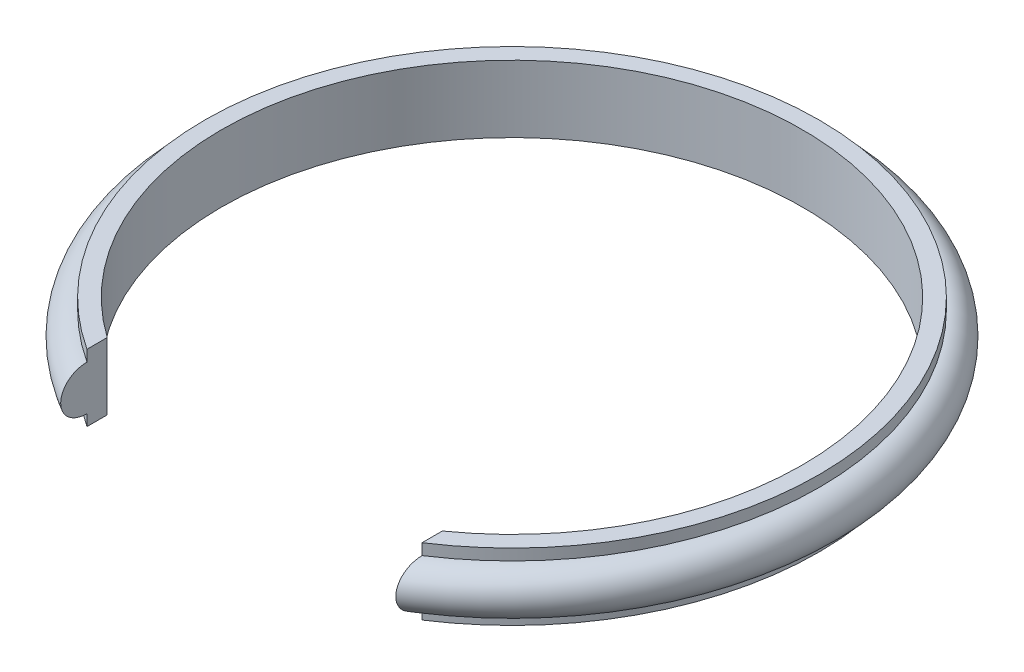
ISO-10303-21;
HEADER;
FILE_DESCRIPTION(('STEP AP214'),'2;1');
FILE_NAME('part.step','',(''),(''),'','','');
FILE_SCHEMA(('AUTOMOTIVE_DESIGN { 1 0 10303 214 1 1 1 1 }'));
ENDSEC;
DATA;
#1=APPLICATION_CONTEXT('core data for automotive mechanical design processes');
#2=APPLICATION_PROTOCOL_DEFINITION('international standard','automotive_design',2000,#1);
#3=PRODUCT_CONTEXT('',#1,'mechanical');
#4=PRODUCT('Part','Part','',(#3));
#5=PRODUCT_RELATED_PRODUCT_CATEGORY('part','',(#4));
#6=PRODUCT_DEFINITION_FORMATION('','',#4);
#7=PRODUCT_DEFINITION_CONTEXT('part definition',#1,'design');
#8=PRODUCT_DEFINITION('design','',#6,#7);
#9=PRODUCT_DEFINITION_SHAPE('','',#8);
#10=(LENGTH_UNIT() NAMED_UNIT(*) SI_UNIT(.MILLI.,.METRE.));
#11=(NAMED_UNIT(*) PLANE_ANGLE_UNIT() SI_UNIT($,.RADIAN.));
#12=(NAMED_UNIT(*) SI_UNIT($,.STERADIAN.) SOLID_ANGLE_UNIT());
#13=UNCERTAINTY_MEASURE_WITH_UNIT(LENGTH_MEASURE(1.E-05),#10,'distance_accuracy_value','');
#14=(GEOMETRIC_REPRESENTATION_CONTEXT(3) GLOBAL_UNCERTAINTY_ASSIGNED_CONTEXT((#13)) GLOBAL_UNIT_ASSIGNED_CONTEXT((#10,
#11,#12)) REPRESENTATION_CONTEXT('',''));
#15=CARTESIAN_POINT('',(0.,0.,0.));
#16=DIRECTION('',(0.,0.,1.));
#17=DIRECTION('',(1.,0.,0.));
#18=AXIS2_PLACEMENT_3D('',#15,#16,#17);
#19=CARTESIAN_POINT('',(-26.,3.,0.));
#20=DIRECTION('',(0.,1.,0.));
#21=DIRECTION('',(0.,0.,1.));
#22=AXIS2_PLACEMENT_3D('',#19,#20,#21);
#23=PLANE('',#22);
#24=CARTESIAN_POINT('',(0.,3.,0.));
#25=DIRECTION('',(0.,1.,0.));
#26=DIRECTION('',(0.,0.,1.));
#27=AXIS2_PLACEMENT_3D('',#24,#25,#26);
#28=CIRCLE('',#27,26.);
#29=CARTESIAN_POINT('',(15.,3.,21.2367605815953));
#30=VERTEX_POINT('',#29);
#31=CARTESIAN_POINT('',(-15.,3.,21.2367605815953));
#32=VERTEX_POINT('',#31);
#33=EDGE_CURVE('E124',#30,#32,#28,.T.);
#34=ORIENTED_EDGE('',*,*,#33,.F.);
#35=DIRECTION('',(0.,0.,-1.));
#36=VECTOR('',#35,1.);
#37=CARTESIAN_POINT('',(15.,3.,29.5));
#38=LINE('',#37,#36);
#39=CARTESIAN_POINT('',(15.,3.,23.0488611432322));
#40=VERTEX_POINT('',#39);
#41=EDGE_CURVE('E66',#40,#30,#38,.T.);
#42=ORIENTED_EDGE('',*,*,#41,.F.);
#43=CARTESIAN_POINT('',(0.,3.,0.));
#44=DIRECTION('',(0.,1.,0.));
#45=DIRECTION('',(0.,0.,1.));
#46=AXIS2_PLACEMENT_3D('',#43,#44,#45);
#47=CIRCLE('',#46,27.5);
#48=CARTESIAN_POINT('',(-15.,3.,23.0488611432322));
#49=VERTEX_POINT('',#48);
#50=EDGE_CURVE('E131',#40,#49,#47,.T.);
#51=ORIENTED_EDGE('',*,*,#50,.T.);
#52=DIRECTION('',(0.,0.,-1.));
#53=VECTOR('',#52,1.);
#54=CARTESIAN_POINT('',(-15.,3.,29.5));
#55=LINE('',#54,#53);
#56=EDGE_CURVE('E141',#49,#32,#55,.T.);
#57=ORIENTED_EDGE('',*,*,#56,.T.);
#58=EDGE_LOOP('',(#34,#42,#51,#57));
#59=FACE_BOUND('',#58,.T.);
#60=ADVANCED_FACE('F43',(#59),#23,.T.);
#61=CARTESIAN_POINT('',(0.,27.5802003193497,0.));
#62=DIRECTION('',(0.,1.,0.));
#63=DIRECTION('',(0.,0.,1.));
#64=AXIS2_PLACEMENT_3D('',#61,#62,#63);
#65=CYLINDRICAL_SURFACE('',#64,27.5);
#66=ORIENTED_EDGE('',*,*,#50,.F.);
#67=DIRECTION('',(0.,1.,0.));
#68=VECTOR('',#67,1.);
#69=CARTESIAN_POINT('',(15.,27.5802003193497,23.0488611432322));
#70=LINE('',#69,#68);
#71=CARTESIAN_POINT('',(15.,2.,23.0488611432322));
#72=VERTEX_POINT('',#71);
#73=EDGE_CURVE('E180',#40,#72,#70,.F.);
#74=ORIENTED_EDGE('',*,*,#73,.T.);
#75=CARTESIAN_POINT('',(0.,2.,0.));
#76=DIRECTION('',(0.,1.,0.));
#77=DIRECTION('',(0.,0.,1.));
#78=AXIS2_PLACEMENT_3D('',#75,#76,#77);
#79=CIRCLE('',#78,27.5);
#80=CARTESIAN_POINT('',(-15.,2.,23.0488611432322));
#81=VERTEX_POINT('',#80);
#82=EDGE_CURVE('E122',#72,#81,#79,.T.);
#83=ORIENTED_EDGE('',*,*,#82,.T.);
#84=DIRECTION('',(0.,1.,0.));
#85=VECTOR('',#84,1.);
#86=CARTESIAN_POINT('',(-15.,27.5802003193497,23.0488611432322));
#87=LINE('',#86,#85);
#88=EDGE_CURVE('E114',#81,#49,#87,.T.);
#89=ORIENTED_EDGE('',*,*,#88,.T.);
#90=EDGE_LOOP('',(#66,#74,#83,#89));
#91=FACE_BOUND('',#90,.T.);
#92=ADVANCED_FACE('F186',(#91),#65,.T.);
#93=CARTESIAN_POINT('',(0.,0.,0.));
#94=DIRECTION('',(0.,1.,0.));
#95=DIRECTION('',(0.,0.,1.));
#96=AXIS2_PLACEMENT_3D('',#93,#94,#95);
#97=TOROIDAL_SURFACE('',#96,27.5,2.);
#98=ORIENTED_EDGE('',*,*,#82,.F.);
#99=CARTESIAN_POINT('',(15.,-1.3810467968494,21.3020797963953));
#100=CARTESIAN_POINT('',(15.,-1.30925317605068,21.2182493287044));
#101=CARTESIAN_POINT('',(15.,-1.23138184536564,21.1396557244507));
#102=CARTESIAN_POINT('',(15.,-1.06411552566978,20.9957879045567));
#103=CARTESIAN_POINT('',(15.,-0.974727937254206,20.9305052040261));
#104=CARTESIAN_POINT('',(15.,-0.785106979799907,20.8160522113769));
#105=CARTESIAN_POINT('',(15.,-0.684794511421905,20.7670114601724));
#106=CARTESIAN_POINT('',(15.,-0.476606048506142,20.6890633511467));
#107=CARTESIAN_POINT('',(15.,-0.368737013364297,20.6601377293205));
#108=CARTESIAN_POINT('',(15.,-0.162011987650907,20.6267460270445));
#109=CARTESIAN_POINT('',(15.,-0.0635458792616844,20.6198498500117));
#110=CARTESIAN_POINT('',(15.,0.132981772175768,20.6240766979406));
#111=CARTESIAN_POINT('',(15.,0.231043435410695,20.6351939147793));
#112=CARTESIAN_POINT('',(15.,0.416786037913445,20.673264358708));
#113=CARTESIAN_POINT('',(15.,0.504711798178058,20.6990477707629));
#114=CARTESIAN_POINT('',(15.,0.675394856313555,20.7640946496206));
#115=CARTESIAN_POINT('',(15.,0.7581513407455,20.8033602316977));
#116=CARTESIAN_POINT('',(15.,0.92233444492895,20.8966349794287));
#117=CARTESIAN_POINT('',(15.,1.00329478585058,20.9514600203759));
#118=CARTESIAN_POINT('',(15.,1.15646257099062,21.072172827047));
#119=CARTESIAN_POINT('',(15.,1.22866579352754,21.1380658922891));
#120=CARTESIAN_POINT('',(15.,1.37438765933014,21.2899593747325));
#121=CARTESIAN_POINT('',(15.,1.44630669535496,21.3774916306939));
#122=CARTESIAN_POINT('',(15.,1.57715552659789,21.5617544872653));
#123=CARTESIAN_POINT('',(15.,1.63607725047769,21.6584907505037));
#124=CARTESIAN_POINT('',(15.,1.75051683249947,21.877423970179));
#125=CARTESIAN_POINT('',(15.,1.80337365126395,22.001014294299));
#126=CARTESIAN_POINT('',(15.,1.8905675746472,22.2545608100633));
#127=CARTESIAN_POINT('',(15.,1.92489352194796,22.3845207855886));
#128=CARTESIAN_POINT('',(15.,1.97852404810143,22.6670225536386));
#129=CARTESIAN_POINT('',(15.,1.99494851374352,22.820118141508));
#130=CARTESIAN_POINT('',(15.,2.00306290197158,23.1270620627619));
#131=CARTESIAN_POINT('',(15.,1.99473538238901,23.2809108506563));
#132=CARTESIAN_POINT('',(15.,1.95192275136653,23.5917253176365));
#133=CARTESIAN_POINT('',(15.,1.91633301054289,23.7485424392901));
#134=CARTESIAN_POINT('',(15.,1.81712628709478,24.0530275510788));
#135=CARTESIAN_POINT('',(15.,1.75354544302568,24.2007070590571));
#136=CARTESIAN_POINT('',(15.,1.61633100789186,24.4482414541228));
#137=CARTESIAN_POINT('',(15.,1.54840079808927,24.5512694648254));
#138=CARTESIAN_POINT('',(15.,1.39644241778162,24.7447638766109));
#139=CARTESIAN_POINT('',(15.,1.31242114700994,24.8352356331533));
#140=CARTESIAN_POINT('',(15.,1.12886805452653,25.000369363317));
#141=CARTESIAN_POINT('',(15.,1.02923201743142,25.0749165229043));
#142=CARTESIAN_POINT('',(15.,0.817360148544076,25.2032884746669));
#143=CARTESIAN_POINT('',(15.,0.705134801265799,25.2571303473483));
#144=CARTESIAN_POINT('',(15.,0.486902304282006,25.3352645528733));
#145=CARTESIAN_POINT('',(15.,0.381928710378516,25.3624506055269));
#146=CARTESIAN_POINT('',(15.,0.168774696224522,25.3968515524956));
#147=CARTESIAN_POINT('',(15.,0.060596453152264,25.4040797049856));
#148=CARTESIAN_POINT('',(15.,-0.145401310729993,25.3984326865354));
#149=CARTESIAN_POINT('',(15.,-0.243273920288058,25.3873143340993));
#150=CARTESIAN_POINT('',(15.,-0.435739976066549,25.3487973234103));
#151=CARTESIAN_POINT('',(15.,-0.53033370547513,25.3214000748488));
#152=CARTESIAN_POINT('',(15.,-0.713871669991789,25.251566233832));
#153=CARTESIAN_POINT('',(15.,-0.802809718041259,25.2091134941299));
#154=CARTESIAN_POINT('',(15.,-0.973007615560048,25.1109442802533));
#155=CARTESIAN_POINT('',(15.,-1.0542655178147,25.0552244548931));
#156=CARTESIAN_POINT('',(15.,-1.21387725116458,24.9275879145972));
#157=CARTESIAN_POINT('',(15.,-1.2914772958827,24.8547314105366));
#158=CARTESIAN_POINT('',(15.,-1.43505864514194,24.6983821290265));
#159=CARTESIAN_POINT('',(15.,-1.50103480903118,24.6148846736159));
#160=CARTESIAN_POINT('',(15.,-1.62866631359384,24.4281187039153));
#161=CARTESIAN_POINT('',(15.,-1.68862594001856,24.3236928352347));
#162=CARTESIAN_POINT('',(15.,-1.79274164879707,24.1072598451404));
#163=CARTESIAN_POINT('',(15.,-1.8368890924912,23.9952486192348));
#164=CARTESIAN_POINT('',(15.,-1.91479949064841,23.7493478936398));
#165=CARTESIAN_POINT('',(15.,-1.94607127652945,23.6146678034073));
#166=CARTESIAN_POINT('',(15.,-1.98822376571954,23.3421661820276));
#167=CARTESIAN_POINT('',(15.,-1.9990950480674,23.204343229226));
#168=CARTESIAN_POINT('',(15.,-2.00089779362575,22.9120976174954));
#169=CARTESIAN_POINT('',(15.,-1.98929806904169,22.7576544747136));
#170=CARTESIAN_POINT('',(15.,-1.94132673784066,22.4524994217921));
#171=CARTESIAN_POINT('',(15.,-1.90492864420825,22.3017916799712));
#172=CARTESIAN_POINT('',(15.,-1.80455260187007,21.9996056341623));
#173=CARTESIAN_POINT('',(15.,-1.73904269341361,21.8486297842723));
#174=CARTESIAN_POINT('',(15.,-1.58044620409592,21.5619847460649));
#175=CARTESIAN_POINT('',(15.,-1.48741734907102,21.4262843293617));
#176=CARTESIAN_POINT('',(15.,-1.3810467968494,21.3020797963953));
#177=B_SPLINE_CURVE_WITH_KNOTS('',3,(#99,#100,#101,#102,#103,#104,#105,#106,#107,#108,#109,#110,
#111,#112,#113,#114,#115,#116,#117,#118,#119,#120,#121,#122,#123,#124,#125,#126,#127,#128,#129,
#130,#131,#132,#133,#134,#135,#136,#137,#138,#139,#140,#141,#142,#143,#144,#145,#146,#147,#148,
#149,#150,#151,#152,#153,#154,#155,#156,#157,#158,#159,#160,#161,#162,#163,#164,#165,#166,#167,
#168,#169,#170,#171,#172,#173,#174,#175,#176),.UNSPECIFIED.,.T.,.F.,(4,2,2,2,2,2,2,2,2,2,2,2,2,
2,2,2,2,2,2,2,2,2,2,2,2,2,2,2,2,2,2,2,2,2,2,2,2,2,4),(0.,0.330718819525607,0.661226162306779,
0.994309384999157,1.32708978067349,1.62160434278354,1.91602396240377,2.18971878909094,
2.46345657654593,2.75565970035601,3.04800313586017,3.3866042559711,3.72541505928143,
4.12710357197059,4.52903366974089,4.98892645005119,5.44914338329794,5.92906373523031,
6.40836628382036,6.77709030672763,7.14565657594857,7.51679660192822,7.88762980153064,
8.21114846187447,8.53445215470603,8.82855417312068,9.1226307271136,9.41702364137793,
9.71149099655259,10.0295418347455,10.3477329795044,10.7075698846574,11.0676030804833,
11.4807253845279,11.8940384217236,12.3566164508192,12.8196893333965,13.3107102983763,
13.8007084774853),.UNSPECIFIED.);
#178=CARTESIAN_POINT('',(15.,-2.,23.0488611432322));
#179=VERTEX_POINT('',#178);
#180=EDGE_CURVE('E113',#72,#179,#177,.T.);
#181=ORIENTED_EDGE('',*,*,#180,.T.);
#182=CARTESIAN_POINT('',(0.,-2.,0.));
#183=DIRECTION('',(0.,1.,0.));
#184=DIRECTION('',(0.,0.,1.));
#185=AXIS2_PLACEMENT_3D('',#182,#183,#184);
#186=CIRCLE('',#185,27.5);
#187=CARTESIAN_POINT('',(-15.,-2.,23.0488611432322));
#188=VERTEX_POINT('',#187);
#189=EDGE_CURVE('E111',#179,#188,#186,.T.);
#190=ORIENTED_EDGE('',*,*,#189,.T.);
#191=CARTESIAN_POINT('',(-15.,-1.3810467968494,21.3020797963953));
#192=CARTESIAN_POINT('',(-15.,-1.47403560129647,21.4106586391947));
#193=CARTESIAN_POINT('',(-15.,-1.55683634155899,21.5280332970997));
#194=CARTESIAN_POINT('',(-15.,-1.70148151507645,21.7750900499588));
#195=CARTESIAN_POINT('',(-15.,-1.76329140081729,21.9047919889698));
#196=CARTESIAN_POINT('',(-15.,-1.86550249975713,22.1715345827153));
#197=CARTESIAN_POINT('',(-15.,-1.90601563630936,22.3085326176188));
#198=CARTESIAN_POINT('',(-15.,-1.96602540205767,22.5869752553164));
#199=CARTESIAN_POINT('',(-15.,-1.98552734823911,22.7284187238431));
#200=CARTESIAN_POINT('',(-15.,-2.00430462091963,23.0284911838002));
#201=CARTESIAN_POINT('',(-15.,-2.00109059584504,23.1872827746686));
#202=CARTESIAN_POINT('',(-15.,-1.96792213284252,23.5022136458087));
#203=CARTESIAN_POINT('',(-15.,-1.93794846152171,23.658350936043));
#204=CARTESIAN_POINT('',(-15.,-1.85098475708004,23.9618527588994));
#205=CARTESIAN_POINT('',(-15.,-1.7941810929091,24.1092700344749));
#206=CARTESIAN_POINT('',(-15.,-1.65343348215962,24.3904792668484));
#207=CARTESIAN_POINT('',(-15.,-1.56954057786932,24.5242962311376));
#208=CARTESIAN_POINT('',(-15.,-1.40184097469875,24.7379298397291));
#209=CARTESIAN_POINT('',(-15.,-1.32414049874952,24.8225657694116));
#210=CARTESIAN_POINT('',(-15.,-1.15578007462465,24.9778528491615));
#211=CARTESIAN_POINT('',(-15.,-1.06512733830022,25.0485117298247));
#212=CARTESIAN_POINT('',(-15.,-0.872086366148406,25.1730300157825));
#213=CARTESIAN_POINT('',(-15.,-0.769631515292587,25.2267869657768));
#214=CARTESIAN_POINT('',(-15.,-0.556364632764228,25.3139112875218));
#215=CARTESIAN_POINT('',(-15.,-0.445557502853367,25.3472905154206));
#216=CARTESIAN_POINT('',(-15.,-0.23174949386673,25.3891842678594));
#217=CARTESIAN_POINT('',(-15.,-0.129194363086537,25.3999908624944));
#218=CARTESIAN_POINT('',(-15.,0.0761804546771174,25.4031443159214));
#219=CARTESIAN_POINT('',(-15.,0.179000024345107,25.3954982940772));
#220=CARTESIAN_POINT('',(-15.,0.376147358754103,25.3630876907081));
#221=CARTESIAN_POINT('',(-15.,0.470633626027898,25.3392714024196));
#222=CARTESIAN_POINT('',(-15.,0.654469791822276,25.2766352152327));
#223=CARTESIAN_POINT('',(-15.,0.743819357489401,25.2378143453074));
#224=CARTESIAN_POINT('',(-15.,0.918386462731373,25.1451977349609));
#225=CARTESIAN_POINT('',(-15.,1.00334996469861,25.0909254727423));
#226=CARTESIAN_POINT('',(-15.,1.16405368227871,24.9701491764147));
#227=CARTESIAN_POINT('',(-15.,1.23979071830059,24.9036409452996));
#228=CARTESIAN_POINT('',(-15.,1.38833970265091,24.7531218556662));
#229=CARTESIAN_POINT('',(-15.,1.46003494886044,24.6680113992457));
#230=CARTESIAN_POINT('',(-15.,1.59021550419084,24.4882528531789));
#231=CARTESIAN_POINT('',(-15.,1.64869430017228,24.3936000941139));
#232=CARTESIAN_POINT('',(-15.,1.75951081306967,24.1832578020704));
#233=CARTESIAN_POINT('',(-15.,1.80979920549202,24.0664891442073));
#234=CARTESIAN_POINT('',(-15.,1.892810915615,23.8268875901136));
#235=CARTESIAN_POINT('',(-15.,1.92552522190557,23.7040516179466));
#236=CARTESIAN_POINT('',(-15.,1.97704581753881,23.4372861901568));
#237=CARTESIAN_POINT('',(-15.,1.99320869820605,23.2928435823198));
#238=CARTESIAN_POINT('',(-15.,2.00333406504501,23.0031327982957));
#239=CARTESIAN_POINT('',(-15.,1.99728014510097,22.8578640911393));
#240=CARTESIAN_POINT('',(-15.,1.9616837077613,22.5563403211972));
#241=CARTESIAN_POINT('',(-15.,1.92998911324762,22.4003344142849));
#242=CARTESIAN_POINT('',(-15.,1.84060298206694,22.095909631912));
#243=CARTESIAN_POINT('',(-15.,1.78291997140339,21.9474882859556));
#244=CARTESIAN_POINT('',(-15.,1.65364638438068,21.6874951469011));
#245=CARTESIAN_POINT('',(-15.,1.58605181261531,21.573934100928));
#246=CARTESIAN_POINT('',(-15.,1.43320232537234,21.3593950999343));
#247=CARTESIAN_POINT('',(-15.,1.3479701728161,21.2584011922654));
#248=CARTESIAN_POINT('',(-15.,1.17711354087377,21.0897876934616));
#249=CARTESIAN_POINT('',(-15.,1.09420307905823,21.0194229570644));
#250=CARTESIAN_POINT('',(-15.,0.917887358305269,20.8932393407972));
#251=CARTESIAN_POINT('',(-15.,0.824486128663581,20.8374149034437));
#252=CARTESIAN_POINT('',(-15.,0.628355568898102,20.7430865948796));
#253=CARTESIAN_POINT('',(-15.,0.525562288659867,20.7047140369062));
#254=CARTESIAN_POINT('',(-15.,0.31446968006215,20.6487198132722));
#255=CARTESIAN_POINT('',(-15.,0.20617539895655,20.6310794718272));
#256=CARTESIAN_POINT('',(-15.,0.00229499530714542,20.6187943662641));
#257=CARTESIAN_POINT('',(-15.,-0.0931382069263188,20.621488718794));
#258=CARTESIAN_POINT('',(-15.,-0.282051993379664,20.6434972146289));
#259=CARTESIAN_POINT('',(-15.,-0.375532794114989,20.6628095049228));
#260=CARTESIAN_POINT('',(-15.,-0.554759436402687,20.7159254372229));
#261=CARTESIAN_POINT('',(-15.,-0.64066024102378,20.7492136086662));
#262=CARTESIAN_POINT('',(-15.,-0.80633975358384,20.8284862913621));
#263=CARTESIAN_POINT('',(-15.,-0.886117989924798,20.8744717793885));
#264=CARTESIAN_POINT('',(-15.,-1.04020731945462,20.9785159656225));
#265=CARTESIAN_POINT('',(-15.,-1.11433503511014,21.0368444699528));
#266=CARTESIAN_POINT('',(-15.,-1.25413422923306,21.1628660967714));
#267=CARTESIAN_POINT('',(-15.,-1.3198003590793,21.2305650868751));
#268=CARTESIAN_POINT('',(-15.,-1.3810467968494,21.3020797963953));
#269=B_SPLINE_CURVE_WITH_KNOTS('',3,(#191,#192,#193,#194,#195,#196,#197,#198,#199,#200,#201,
#202,#203,#204,#205,#206,#207,#208,#209,#210,#211,#212,#213,#214,#215,#216,#217,#218,#219,#220,
#221,#222,#223,#224,#225,#226,#227,#228,#229,#230,#231,#232,#233,#234,#235,#236,#237,#238,#239,
#240,#241,#242,#243,#244,#245,#246,#247,#248,#249,#250,#251,#252,#253,#254,#255,#256,#257,#258,
#259,#260,#261,#262,#263,#264,#265,#266,#267,#268),.UNSPECIFIED.,.T.,.F.,(4,2,2,2,2,2,2,2,2,2,2,
2,2,2,2,2,2,2,2,2,2,2,2,2,2,2,2,2,2,2,2,2,2,2,2,2,2,2,4),(0.,0.428482443655698,
0.857666719859076,1.28457231503125,1.71136985424467,2.18560992716189,2.66019113296902,
3.13152318039111,3.60197226324422,3.94525757332411,4.28835248082694,4.63348874314275,
4.97842400673391,5.28618403892286,5.59382535053151,5.88482668367091,6.17584685221954,
6.47705170327929,6.77836006256891,7.11089659653352,7.44359665072302,7.82351268275139,
8.20362333765485,8.63785412630073,9.07240563950768,9.54775913879089,10.0229568025785,
10.4178725016506,10.8122816692869,11.1372123446541,11.4620186446203,11.7892300165041,
12.1161464066939,12.4011030234717,12.6860278698022,12.9612573465797,13.2365080019972,
13.5185476089212,13.800764629314),.UNSPECIFIED.);
#270=EDGE_CURVE('E155',#188,#81,#269,.T.);
#271=ORIENTED_EDGE('',*,*,#270,.T.);
#272=EDGE_LOOP('',(#98,#181,#190,#271));
#273=FACE_BOUND('',#272,.T.);
#274=ADVANCED_FACE('F164',(#273),#97,.T.);
#275=CARTESIAN_POINT('',(0.,27.5802003193497,0.));
#276=DIRECTION('',(0.,1.,0.));
#277=DIRECTION('',(0.,0.,1.));
#278=AXIS2_PLACEMENT_3D('',#275,#276,#277);
#279=CYLINDRICAL_SURFACE('',#278,27.5);
#280=ORIENTED_EDGE('',*,*,#189,.F.);
#281=DIRECTION('',(0.,1.,0.));
#282=VECTOR('',#281,1.);
#283=CARTESIAN_POINT('',(15.,27.5802003193497,23.0488611432322));
#284=LINE('',#283,#282);
#285=CARTESIAN_POINT('',(15.,-3.,23.0488611432322));
#286=VERTEX_POINT('',#285);
#287=EDGE_CURVE('E96',#179,#286,#284,.F.);
#288=ORIENTED_EDGE('',*,*,#287,.T.);
#289=CARTESIAN_POINT('',(0.,-3.,0.));
#290=DIRECTION('',(0.,1.,0.));
#291=DIRECTION('',(0.,0.,1.));
#292=AXIS2_PLACEMENT_3D('',#289,#290,#291);
#293=CIRCLE('',#292,27.5);
#294=CARTESIAN_POINT('',(-15.,-3.,23.0488611432322));
#295=VERTEX_POINT('',#294);
#296=EDGE_CURVE('E109',#286,#295,#293,.T.);
#297=ORIENTED_EDGE('',*,*,#296,.T.);
#298=DIRECTION('',(0.,1.,0.));
#299=VECTOR('',#298,1.);
#300=CARTESIAN_POINT('',(-15.,27.5802003193497,23.0488611432322));
#301=LINE('',#300,#299);
#302=EDGE_CURVE('E149',#295,#188,#301,.T.);
#303=ORIENTED_EDGE('',*,*,#302,.T.);
#304=EDGE_LOOP('',(#280,#288,#297,#303));
#305=FACE_BOUND('',#304,.T.);
#306=ADVANCED_FACE('F107',(#305),#279,.T.);
#307=CARTESIAN_POINT('',(-27.5,-3.,0.));
#308=DIRECTION('',(0.,-1.,0.));
#309=DIRECTION('',(0.,0.,-1.));
#310=AXIS2_PLACEMENT_3D('',#307,#308,#309);
#311=PLANE('',#310);
#312=ORIENTED_EDGE('',*,*,#296,.F.);
#313=DIRECTION('',(0.,0.,-1.));
#314=VECTOR('',#313,1.);
#315=CARTESIAN_POINT('',(15.,-3.,29.5));
#316=LINE('',#315,#314);
#317=CARTESIAN_POINT('',(15.,-3.,21.2367605815953));
#318=VERTEX_POINT('',#317);
#319=EDGE_CURVE('E93',#286,#318,#316,.T.);
#320=ORIENTED_EDGE('',*,*,#319,.T.);
#321=CARTESIAN_POINT('',(0.,-3.,0.));
#322=DIRECTION('',(0.,1.,0.));
#323=DIRECTION('',(0.,0.,1.));
#324=AXIS2_PLACEMENT_3D('',#321,#322,#323);
#325=CIRCLE('',#324,26.);
#326=CARTESIAN_POINT('',(-15.,-3.,21.2367605815953));
#327=VERTEX_POINT('',#326);
#328=EDGE_CURVE('E118',#318,#327,#325,.T.);
#329=ORIENTED_EDGE('',*,*,#328,.T.);
#330=DIRECTION('',(0.,0.,-1.));
#331=VECTOR('',#330,1.);
#332=CARTESIAN_POINT('',(-15.,-3.,29.5));
#333=LINE('',#332,#331);
#334=EDGE_CURVE('E58',#295,#327,#333,.T.);
#335=ORIENTED_EDGE('',*,*,#334,.F.);
#336=EDGE_LOOP('',(#312,#320,#329,#335));
#337=FACE_BOUND('',#336,.T.);
#338=ADVANCED_FACE('F116',(#337),#311,.T.);
#339=CARTESIAN_POINT('',(0.,27.5802003193497,0.));
#340=DIRECTION('',(0.,1.,0.));
#341=DIRECTION('',(0.,0.,1.));
#342=AXIS2_PLACEMENT_3D('',#339,#340,#341);
#343=CYLINDRICAL_SURFACE('',#342,26.);
#344=ORIENTED_EDGE('',*,*,#328,.F.);
#345=DIRECTION('',(0.,1.,0.));
#346=VECTOR('',#345,1.);
#347=CARTESIAN_POINT('',(15.,27.5802003193497,21.2367605815953));
#348=LINE('',#347,#346);
#349=EDGE_CURVE('E11',#318,#30,#348,.T.);
#350=ORIENTED_EDGE('',*,*,#349,.T.);
#351=ORIENTED_EDGE('',*,*,#33,.T.);
#352=DIRECTION('',(0.,1.,0.));
#353=VECTOR('',#352,1.);
#354=CARTESIAN_POINT('',(-15.,27.5802003193497,21.2367605815953));
#355=LINE('',#354,#353);
#356=EDGE_CURVE('E51',#32,#327,#355,.F.);
#357=ORIENTED_EDGE('',*,*,#356,.T.);
#358=EDGE_LOOP('',(#344,#350,#351,#357));
#359=FACE_BOUND('',#358,.T.);
#360=ADVANCED_FACE('F137',(#359),#343,.F.);
#361=CARTESIAN_POINT('',(-15.,-3.,29.5));
#362=DIRECTION('',(1.,0.,0.));
#363=DIRECTION('',(0.,0.,-1.));
#364=AXIS2_PLACEMENT_3D('',#361,#362,#363);
#365=PLANE('',#364);
#366=ORIENTED_EDGE('',*,*,#270,.F.);
#367=ORIENTED_EDGE('',*,*,#302,.F.);
#368=ORIENTED_EDGE('',*,*,#334,.T.);
#369=ORIENTED_EDGE('',*,*,#356,.F.);
#370=ORIENTED_EDGE('',*,*,#56,.F.);
#371=ORIENTED_EDGE('',*,*,#88,.F.);
#372=EDGE_LOOP('',(#366,#367,#368,#369,#370,#371));
#373=FACE_BOUND('',#372,.T.);
#374=ADVANCED_FACE('F140',(#373),#365,.T.);
#375=CARTESIAN_POINT('',(15.,-3.,29.5));
#376=DIRECTION('',(-1.,0.,0.));
#377=DIRECTION('',(0.,0.,1.));
#378=AXIS2_PLACEMENT_3D('',#375,#376,#377);
#379=PLANE('',#378);
#380=ORIENTED_EDGE('',*,*,#41,.T.);
#381=ORIENTED_EDGE('',*,*,#349,.F.);
#382=ORIENTED_EDGE('',*,*,#319,.F.);
#383=ORIENTED_EDGE('',*,*,#287,.F.);
#384=ORIENTED_EDGE('',*,*,#180,.F.);
#385=ORIENTED_EDGE('',*,*,#73,.F.);
#386=EDGE_LOOP('',(#380,#381,#382,#383,#384,#385));
#387=FACE_BOUND('',#386,.T.);
#388=ADVANCED_FACE('F95',(#387),#379,.T.);
#389=CLOSED_SHELL('',(#60,#92,#274,#306,#338,#360,#374,#388));
#390=MANIFOLD_SOLID_BREP('B2',#389);
#391=ADVANCED_BREP_SHAPE_REPRESENTATION('',(#18,#390),#14);
#392=SHAPE_DEFINITION_REPRESENTATION(#9,#391);
ENDSEC;
END-ISO-10303-21;
